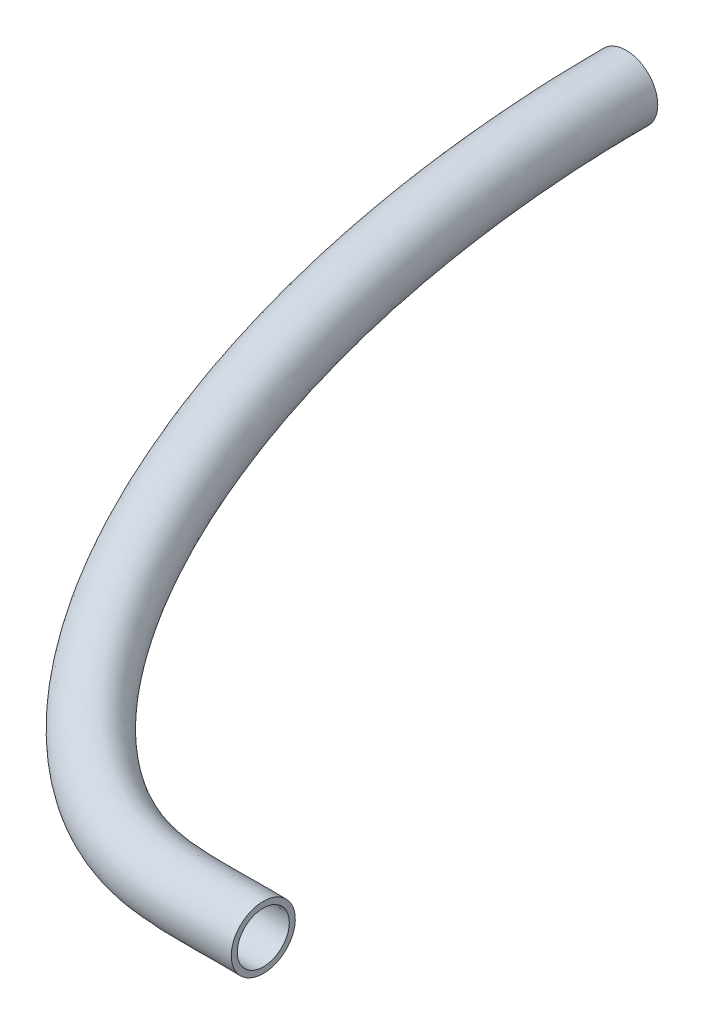
ISO-10303-21;
HEADER;
FILE_DESCRIPTION(('STEP AP214'),'2;1');
FILE_NAME('part.step','',(''),(''),'','','');
FILE_SCHEMA(('AUTOMOTIVE_DESIGN { 1 0 10303 214 1 1 1 1 }'));
ENDSEC;
DATA;
#1=APPLICATION_CONTEXT('core data for automotive mechanical design processes');
#2=APPLICATION_PROTOCOL_DEFINITION('international standard','automotive_design',2000,#1);
#3=PRODUCT_CONTEXT('',#1,'mechanical');
#4=PRODUCT('Part','Part','',(#3));
#5=PRODUCT_RELATED_PRODUCT_CATEGORY('part','',(#4));
#6=PRODUCT_DEFINITION_FORMATION('','',#4);
#7=PRODUCT_DEFINITION_CONTEXT('part definition',#1,'design');
#8=PRODUCT_DEFINITION('design','',#6,#7);
#9=PRODUCT_DEFINITION_SHAPE('','',#8);
#10=(LENGTH_UNIT() NAMED_UNIT(*) SI_UNIT(.MILLI.,.METRE.));
#11=(NAMED_UNIT(*) PLANE_ANGLE_UNIT() SI_UNIT($,.RADIAN.));
#12=(NAMED_UNIT(*) SI_UNIT($,.STERADIAN.) SOLID_ANGLE_UNIT());
#13=UNCERTAINTY_MEASURE_WITH_UNIT(LENGTH_MEASURE(1.E-05),#10,'distance_accuracy_value','');
#14=(GEOMETRIC_REPRESENTATION_CONTEXT(3) GLOBAL_UNCERTAINTY_ASSIGNED_CONTEXT((#13)) GLOBAL_UNIT_ASSIGNED_CONTEXT((#10,
#11,#12)) REPRESENTATION_CONTEXT('',''));
#15=CARTESIAN_POINT('',(0.,0.,0.));
#16=DIRECTION('',(0.,0.,1.));
#17=DIRECTION('',(1.,0.,0.));
#18=AXIS2_PLACEMENT_3D('',#15,#16,#17);
#19=CARTESIAN_POINT('',(12.1586843067844,-7.52751038817287,0.));
#20=CARTESIAN_POINT('',(12.1586843067127,-7.52751038847759,41.1975525196105));
#21=CARTESIAN_POINT('',(12.8432206544592,-12.1097544256163,77.7303698545293));
#22=CARTESIAN_POINT('',(16.0276178795649,-22.5063376339829,125.210805236656));
#23=CARTESIAN_POINT('',(17.4481988464369,-26.5583328215066,139.817209254101));
#24=CARTESIAN_POINT('',(20.2434339619281,-33.0865597147382,159.846127553321));
#25=CARTESIAN_POINT('',(21.2857398575284,-35.3375648297478,166.208889992822));
#26=CARTESIAN_POINT('',(22.7378735440379,-38.1993574676171,173.764468662107));
#27=CARTESIAN_POINT('',(23.0357552451373,-38.7741159067826,175.255688694486));
#28=CARTESIAN_POINT('',(23.4939424466096,-39.638990247409,177.462559069099));
#29=CARTESIAN_POINT('',(23.648384917167,-39.934936066806,178.190329675185));
#30=CARTESIAN_POINT('',(23.9625640615991,-40.4700906146351,179.658580538403));
#31=CARTESIAN_POINT('',(24.1222666785517,-40.7107506925654,180.398584429151));
#32=CARTESIAN_POINT('',(24.9290518773624,-41.8276463207582,184.11168857733));
#33=CARTESIAN_POINT('',(25.596518824201,-42.7299859497505,187.009199653802));
#34=CARTESIAN_POINT('',(29.0521015910951,-47.2758318351706,201.12468428905));
#35=CARTESIAN_POINT('',(32.1941545984994,-51.0331040791956,211.2248487293));
#36=CARTESIAN_POINT('',(39.5013817329044,-58.3768667479807,228.851562229635));
#37=CARTESIAN_POINT('',(43.6722722911921,-61.9532736439962,236.370319473424));
#38=CARTESIAN_POINT('',(50.8035433234006,-66.735201828949,245.695964691155));
#39=CARTESIAN_POINT('',(53.324445756884,-68.2319031978676,248.481403575702));
#40=CARTESIAN_POINT('',(58.6690648791445,-70.9714229653328,253.436402206764));
#41=CARTESIAN_POINT('',(61.4919404521863,-72.2144599448679,255.606558464509));
#42=CARTESIAN_POINT('',(67.4829695291432,-74.4031819844309,259.377311696391));
#43=CARTESIAN_POINT('',(70.6513201726939,-75.3496740177342,260.97897567528));
#44=CARTESIAN_POINT('',(77.4187286732156,-76.902164567047,263.648304616309));
#45=CARTESIAN_POINT('',(81.0192092392658,-77.5086250124912,264.716349032614));
#46=CARTESIAN_POINT('',(85.6126147160689,-77.9875654913768,265.667044997799));
#47=CARTESIAN_POINT('',(86.3574792173627,-78.0651986450064,265.776542196973));
#48=CARTESIAN_POINT('',(87.8769288259186,-78.2118929662791,265.960875363933));
#49=CARTESIAN_POINT('',(88.6508119807861,-78.2786912949391,266.044812815406));
#50=CARTESIAN_POINT('',(91.0150601751882,-78.4607083368753,266.27353181065));
#51=CARTESIAN_POINT('',(92.6480861684886,-78.5575019338745,266.395160719871));
#52=CARTESIAN_POINT('',(97.7154982968154,-78.7859451977329,266.682217982399));
#53=CARTESIAN_POINT('',(101.318234375749,-78.8550462168895,266.769048949081));
#54=CARTESIAN_POINT('',(112.761863849584,-78.9312717968913,266.864832496717));
#55=CARTESIAN_POINT('',(121.233814581769,-78.804170795922,266.705119908072));
#56=CARTESIAN_POINT('',(130.466353488673,-78.8940352313156,266.81804176915));
#57=CARTESIAN_POINT('',(12.1586843067844,16.7898582253958,0.));
#58=CARTESIAN_POINT('',(12.1586843066947,16.7898582254496,42.9990222116649));
#59=CARTESIAN_POINT('',(12.8723735872278,12.0005973383329,81.3051298975339));
#60=CARTESIAN_POINT('',(16.2195974159491,1.07266559470776,131.212202421823));
#61=CARTESIAN_POINT('',(17.7144560272099,-3.1920597757677,146.589147568087));
#62=CARTESIAN_POINT('',(20.6597925400027,-10.0707185281473,167.693209914881));
#63=CARTESIAN_POINT('',(21.7585484719433,-12.4436822008069,174.400891345326));
#64=CARTESIAN_POINT('',(23.2897679867195,-15.4613095135952,182.36789800938));
#65=CARTESIAN_POINT('',(23.6038924956125,-16.0674016470866,183.9404151843));
#66=CARTESIAN_POINT('',(24.0870849005691,-16.9794613805486,186.267686974441));
#67=CARTESIAN_POINT('',(24.2651439421214,-17.29034532218,187.032307992103));
#68=CARTESIAN_POINT('',(24.5055798404796,-17.8617671657379,188.597669246575));
#69=CARTESIAN_POINT('',(24.5709570531288,-18.1237132473793,189.397547567295));
#70=CARTESIAN_POINT('',(24.7200614404185,-19.367092543026,193.448408627697));
#71=CARTESIAN_POINT('',(24.8681227578949,-20.3958942823677,196.618968238852));
#72=CARTESIAN_POINT('',(25.7904591181671,-25.6968217714256,212.112385951867));
#73=CARTESIAN_POINT('',(27.1251775830531,-30.4598572078821,223.351533188934));
#74=CARTESIAN_POINT('',(31.8361476379713,-40.3052491722367,243.366048622979));
#75=CARTESIAN_POINT('',(35.2110825190456,-45.3701789931757,252.147495307245));
#76=CARTESIAN_POINT('',(42.1056176380643,-52.5054427149052,263.422734447782));
#77=CARTESIAN_POINT('',(44.7062576104599,-54.807268175301,266.864795876721));
#78=CARTESIAN_POINT('',(50.532428429765,-59.1509204078366,273.096360789708));
#79=CARTESIAN_POINT('',(53.7581319056505,-61.1926891733201,275.885627887412));
#80=CARTESIAN_POINT('',(60.8324271415119,-64.9128805473243,280.78376742386));
#81=CARTESIAN_POINT('',(64.6807895881424,-66.5909947570791,282.89212327362));
#82=CARTESIAN_POINT('',(72.9749066259975,-69.489392208673,286.404644108681));
#83=CARTESIAN_POINT('',(77.4198760623726,-70.709576045639,287.808668551372));
#84=CARTESIAN_POINT('',(83.0347985783379,-71.8412417337126,289.054026461098));
#85=CARTESIAN_POINT('',(83.9448359587043,-71.9548434542553,289.190273014995));
#86=CARTESIAN_POINT('',(85.7808936992905,-72.1321045115651,289.413015734589));
#87=CARTESIAN_POINT('',(86.7044278146761,-72.211708574661,289.513044617326));
#88=CARTESIAN_POINT('',(89.4916065774672,-72.4262858915024,289.78267820648));
#89=CARTESIAN_POINT('',(91.3717952874428,-72.5370487994941,289.921860674111));
#90=CARTESIAN_POINT('',(97.0807385270225,-72.7944128334708,290.245259201314));
#91=CARTESIAN_POINT('',(100.977861954208,-72.866407028523,290.335725675255));
#92=CARTESIAN_POINT('',(112.970454636422,-72.946289231635,290.436104062768));
#93=CARTESIAN_POINT('',(121.36941536279,-72.8197137472078,290.277051827634));
#94=CARTESIAN_POINT('',(130.236387281418,-72.9060199553362,290.38550249122));
#95=CARTESIAN_POINT('',(-12.1586843067844,16.7898582253958,0.));
#96=CARTESIAN_POINT('',(-12.1586843067306,16.789858225593,43.2667417442443));
#97=CARTESIAN_POINT('',(-11.44896610806,11.9793933573731,82.0468911595671));
#98=CARTESIAN_POINT('',(-8.01716826985207,0.775418528499522,133.215000833013));
#99=CARTESIAN_POINT('',(-6.47806276599943,-3.62349820437571,149.105172799613));
#100=CARTESIAN_POINT('',(-3.39889628243626,-10.81466029745,171.168188607289));
#101=CARTESIAN_POINT('',(-2.24395424747955,-13.3105468695261,178.227231473753));
#102=CARTESIAN_POINT('',(-0.619428500753249,-16.5120454965001,186.679721505122));
#103=CARTESIAN_POINT('',(-0.285473861222463,-17.1564265785618,188.351653397099));
#104=CARTESIAN_POINT('',(0.229428356981685,-18.1283341825885,190.831658211143));
#105=CARTESIAN_POINT('',(0.418746182289974,-18.4451733046582,191.653511207783));
#106=CARTESIAN_POINT('',(0.679438497043376,-19.1443449695036,193.289131258063));
#107=CARTESIAN_POINT('',(0.753881456149703,-19.5251829930562,194.10298912852));
#108=CARTESIAN_POINT('',(0.952828361048926,-21.5410847374464,198.150572915091));
#109=CARTESIAN_POINT('',(1.16407175976329,-23.1870684756282,201.314037164922));
#110=CARTESIAN_POINT('',(2.51810265148887,-31.5474232248089,216.761406484199));
#111=CARTESIAN_POINT('',(4.57029976329344,-38.6506101909509,227.933079690626));
#112=CARTESIAN_POINT('',(11.3175886952965,-52.7041593257679,248.062566711847));
#113=CARTESIAN_POINT('',(15.9999309438898,-59.6572618465298,257.042042647318));
#114=CARTESIAN_POINT('',(25.3861675437543,-69.3688834566938,268.795963071672));
#115=CARTESIAN_POINT('',(28.909827300712,-72.487166686324,272.42324665755));
#116=CARTESIAN_POINT('',(36.7856891105547,-78.362581349095,279.007506104911));
#117=CARTESIAN_POINT('',(41.1397460235438,-81.1192176143535,281.963052558088));
#118=CARTESIAN_POINT('',(50.6385985294994,-86.1197648894087,287.074967892651));
#119=CARTESIAN_POINT('',(55.7827705292926,-88.3617535544579,289.228686175097));
#120=CARTESIAN_POINT('',(66.714624829818,-92.1896401248808,292.633635004043));
#121=CARTESIAN_POINT('',(72.4986765570719,-93.774514766949,293.883966098529));
#122=CARTESIAN_POINT('',(79.6391036211194,-95.2197628278554,294.825627615149));
#123=CARTESIAN_POINT('',(80.7702305703068,-95.3612605153826,294.973037842113));
#124=CARTESIAN_POINT('',(83.0228877722456,-95.5787419096972,295.246320637387));
#125=CARTESIAN_POINT('',(84.1433356849533,-95.6751960203262,295.367522954723));
#126=CARTESIAN_POINT('',(87.4870151473063,-95.9326168133597,295.690992804207));
#127=CARTESIAN_POINT('',(89.69242561937,-96.0617608267505,295.853272603284));
#128=CARTESIAN_POINT('',(96.2455086282053,-96.3571794021045,296.224489710394));
#129=CARTESIAN_POINT('',(100.529992954463,-96.4329804972287,296.319739859285));
#130=CARTESIAN_POINT('',(113.244922663358,-96.517674159823,296.426164231111));
#131=CARTESIAN_POINT('',(121.547841647068,-96.3917901607381,296.267980902884));
#132=CARTESIAN_POINT('',(129.933793038329,-96.4734143807128,296.37054827308));
#133=CARTESIAN_POINT('',(-12.1586843067844,-7.52751038817287,0.));
#134=CARTESIAN_POINT('',(-12.1586843067127,-7.52751038833419,41.4652720521899));
#135=CARTESIAN_POINT('',(-11.4781190408572,-12.1309584065761,78.4721311164484));
#136=CARTESIAN_POINT('',(-8.20914780622197,-22.8035847001912,127.213603647902));
#137=CARTESIAN_POINT('',(-6.74431994676618,-26.9897712501146,142.333234485627));
#138=CARTESIAN_POINT('',(-3.81525486051396,-33.8305014840408,163.321106245728));
#139=CARTESIAN_POINT('',(-2.71676286189153,-36.2044294984729,170.035230121202));
#140=CARTESIAN_POINT('',(-1.17132294343553,-39.2500934505205,178.076292157861));
#141=CARTESIAN_POINT('',(-0.853611111696972,-39.8631408382564,179.666926907297));
#142=CARTESIAN_POINT('',(-0.36371409697813,-40.7878630494496,182.026530305796));
#143=CARTESIAN_POINT('',(-0.198012842664056,-41.0897640492857,182.811532890859));
#144=CARTESIAN_POINT('',(0.136422718162423,-41.7526684183993,184.350042549897));
#145=CARTESIAN_POINT('',(0.305191081572968,-42.112220438241,185.104025990376));
#146=CARTESIAN_POINT('',(1.16181879799139,-44.0016385151842,188.813852864723));
#147=CARTESIAN_POINT('',(1.89246782607208,-45.5211601430137,191.704268579873));
#148=CARTESIAN_POINT('',(5.77974512440591,-53.126433288543,205.773704821382));
#149=CARTESIAN_POINT('',(9.63927677873972,-59.2238570622267,215.806395230993));
#150=CARTESIAN_POINT('',(18.9828227902296,-70.7757769015496,233.548080318502));
#151=CARTESIAN_POINT('',(24.4611207160444,-76.2403564973177,241.264866813628));
#152=CARTESIAN_POINT('',(34.0840932290865,-83.5986425707538,251.069193314979));
#153=CARTESIAN_POINT('',(37.5280154471207,-85.9118017088752,254.0398543565));
#154=CARTESIAN_POINT('',(44.9223255599496,-90.1830839066067,259.347547521998));
#155=CARTESIAN_POINT('',(48.873554570072,-92.1409883859012,261.683983135244));
#156=CARTESIAN_POINT('',(57.2891409171383,-95.6100663265152,265.668512165122));
#157=CARTESIAN_POINT('',(61.7533011138442,-97.1204328151282,267.315538576847));
#158=CARTESIAN_POINT('',(71.1584468770361,-99.6024124832396,269.877295511581));
#159=CARTESIAN_POINT('',(76.0980097339492,-100.573563733817,270.79164657974));
#160=CARTESIAN_POINT('',(82.2169197588534,-101.366086585517,271.438646151856));
#161=CARTESIAN_POINT('',(83.1828738289622,-101.471615706131,271.559307024098));
#162=CARTESIAN_POINT('',(85.1189228988768,-101.658530364414,271.794180266724));
#163=CARTESIAN_POINT('',(86.0897198510603,-101.742178740598,271.899291152821));
#164=CARTESIAN_POINT('',(89.0104687450335,-101.967039258745,272.181846408341));
#165=CARTESIAN_POINT('',(90.9687165004158,-102.082213961125,272.326572649018));
#166=CARTESIAN_POINT('',(96.8802683979982,-102.348711766379,272.66144849153));
#167=CARTESIAN_POINT('',(100.870365376003,-102.421619685609,272.75306313311));
#168=CARTESIAN_POINT('',(113.036331876519,-102.502656725052,272.85489266506));
#169=CARTESIAN_POINT('',(121.412240866297,-102.376247209577,272.696048983197));
#170=CARTESIAN_POINT('',(130.163759245584,-102.461429656692,272.803087551009));
#171=CARTESIAN_POINT('',(-12.1586843067844,-31.8448790017416,0.));
#172=CARTESIAN_POINT('',(-12.1586843066947,-31.8448790022614,39.6638023601354));
#173=CARTESIAN_POINT('',(-11.5072719736543,-36.2413101705253,74.8973710733297));
#174=CARTESIAN_POINT('',(-8.40112734259187,-46.3825879288818,121.212206462791));
#175=CARTESIAN_POINT('',(-7.01057712753292,-50.3560442958536,135.561296171642));
#176=CARTESIAN_POINT('',(-4.23161343859166,-56.8463426706317,155.474023884168));
#177=CARTESIAN_POINT('',(-3.18957147630351,-59.0983121274197,161.843228768651));
#178=CARTESIAN_POINT('',(-1.72321738611782,-61.9881414045409,169.4728628106));
#179=CARTESIAN_POINT('',(-1.42174836217148,-62.5698550979509,170.982200417496));
#180=CARTESIAN_POINT('',(-0.956856550937946,-63.4473919163108,173.221402400449));
#181=CARTESIAN_POINT('',(-0.814771867618087,-63.7343547939131,173.969554573936));
#182=CARTESIAN_POINT('',(-0.40659306071853,-64.360991867295,175.410953841731));
#183=CARTESIAN_POINT('',(-0.143499293003768,-64.6992578834257,176.105062852232));
#184=CARTESIAN_POINT('',(1.37080923493386,-66.462192292922,179.477132814356));
#185=CARTESIAN_POINT('',(2.62086389238087,-67.8552518103992,182.094499994823));
#186=CARTESIAN_POINT('',(9.04138759732295,-74.705443352277,194.786003158565));
#187=CARTESIAN_POINT('',(14.708253794186,-79.7971039335026,203.67971077136));
#188=CARTESIAN_POINT('',(26.6480568851627,-88.8473944773313,219.033593925158));
#189=CARTESIAN_POINT('',(32.9223104881991,-92.8234511481055,225.487690979938));
#190=CARTESIAN_POINT('',(42.7820189144188,-97.8284016848139,233.342423558287));
#191=CARTESIAN_POINT('',(46.1462035935294,-99.3364367314264,235.656462055451));
#192=CARTESIAN_POINT('',(53.0589620093446,-102.003586464118,239.687588939085));
#193=CARTESIAN_POINT('',(56.6073631166003,-103.162759157449,241.404913712401));
#194=CARTESIAN_POINT('',(63.9396833047771,-105.100367763622,244.262056437592));
#195=CARTESIAN_POINT('',(67.7238316983958,-105.879112075799,245.402390978597));
#196=CARTESIAN_POINT('',(75.6022689242542,-107.015184841598,247.120956019119));
#197=CARTESIAN_POINT('',(79.6973429108265,-107.372612700685,247.699327060951));
#198=CARTESIAN_POINT('',(84.7947358965875,-107.512410343178,248.051664688563));
#199=CARTESIAN_POINT('',(85.5955170876176,-107.581970896879,248.145576206083));
#200=CARTESIAN_POINT('',(87.2149580255079,-107.738318819131,248.342039896062));
#201=CARTESIAN_POINT('',(88.0361040171672,-107.80916146087,248.431059350919));
#202=CARTESIAN_POINT('',(90.5339223427606,-108.00146170413,248.672700012475));
#203=CARTESIAN_POINT('',(92.2450073814615,-108.102667095499,248.799872694752));
#204=CARTESIAN_POINT('',(97.5150281677911,-108.340244130654,249.098407272666));
#205=CARTESIAN_POINT('',(101.210737797543,-108.410258873989,249.186386406935));
#206=CARTESIAN_POINT('',(112.827741089681,-108.487639290281,249.283621099009));
#207=CARTESIAN_POINT('',(121.276640085525,-108.360704258416,249.12411706351));
#208=CARTESIAN_POINT('',(130.393725452838,-108.449444932672,249.235626828939));
#209=CARTESIAN_POINT('',(12.1586843067844,-31.8448790017416,0.));
#210=CARTESIAN_POINT('',(12.1586843067306,-31.8448790024048,39.396082827556));
#211=CARTESIAN_POINT('',(12.8140677216906,-36.2201061895656,74.1556098115248));
#212=CARTESIAN_POINT('',(15.8356383431807,-46.0853408626736,119.209408051488));
#213=CARTESIAN_POINT('',(17.1819416656639,-49.9246058672456,133.045270940115));
#214=CARTESIAN_POINT('',(19.8270753838536,-56.102400901329,151.99904519176));
#215=CARTESIAN_POINT('',(20.8129312431135,-58.2314474586887,158.016888640318));
#216=CARTESIAN_POINT('',(22.1859791013564,-60.9374054216389,165.161039314834));
#217=CARTESIAN_POINT('',(22.4676179946621,-61.4808301664786,166.570962204673));
#218=CARTESIAN_POINT('',(22.9007999926502,-62.2985191142695,168.657431163758));
#219=CARTESIAN_POINT('',(23.0316258922126,-62.579526811432,169.348351358267));
#220=CARTESIAN_POINT('',(23.4195482827185,-63.0784140635322,170.719491830231));
#221=CARTESIAN_POINT('',(23.6735763039747,-63.2977881377516,171.399621291007));
#222=CARTESIAN_POINT('',(25.1380423143063,-64.2882000984903,174.774968526962));
#223=CARTESIAN_POINT('',(26.3249148905071,-65.0640776171333,177.399431068753));
#224=CARTESIAN_POINT('',(32.3137440640231,-68.8548418989156,190.136982626233));
#225=CARTESIAN_POINT('',(37.2631316139456,-71.6063509505091,199.098164269667));
#226=CARTESIAN_POINT('',(47.1666158278375,-76.4484843237247,214.33707583629));
#227=CARTESIAN_POINT('',(52.1334620633386,-78.5363682948166,220.593143639604));
#228=CARTESIAN_POINT('',(59.5014690087369,-80.9649609429927,227.969194934527));
#229=CARTESIAN_POINT('',(61.9426339033082,-81.6565382204343,230.098011274684));
#230=CARTESIAN_POINT('',(66.805701328524,-82.7919255228291,233.776443623821));
#231=CARTESIAN_POINT('',(69.2257489987221,-83.2362307164156,235.327489041605));
#232=CARTESIAN_POINT('',(74.1335119167745,-83.8934834215374,237.970855968921));
#233=CARTESIAN_POINT('',(76.6218507572455,-84.1083532783894,239.065828076939));
#234=CARTESIAN_POINT('',(81.8625507204337,-84.3149369254209,240.891965123938));
#235=CARTESIAN_POINT('',(84.6185424161591,-84.3076739793435,241.624029513857));
#236=CARTESIAN_POINT('',(88.1904308538,-84.133889249041,242.280063534499));
#237=CARTESIAN_POINT('',(88.7701224760212,-84.1755538357575,242.362811378952));
#238=CARTESIAN_POINT('',(89.9729639525467,-84.2916814209932,242.508734993277));
#239=CARTESIAN_POINT('',(90.5971961468962,-84.3456740152172,242.576581013485));
#240=CARTESIAN_POINT('',(92.5385137729092,-84.4951307822483,242.764385414821));
#241=CARTESIAN_POINT('',(93.9243770495344,-84.577955068255,242.86846076563));
#242=CARTESIAN_POINT('',(98.3502580666083,-84.777477561995,243.119176763484));
#243=CARTESIAN_POINT('',(101.658606797289,-84.8436854052561,243.202372222905));
#244=CARTESIAN_POINT('',(112.553273062745,-84.9162543621476,243.293560930666));
#245=CARTESIAN_POINT('',(121.098213800748,-84.7886278446361,243.133187988509));
#246=CARTESIAN_POINT('',(130.696319695927,-84.882050507295,243.250581047079));
#247=CARTESIAN_POINT('',(12.1586843067844,-7.52751038817287,0.));
#248=CARTESIAN_POINT('',(12.1586843067127,-7.52751038847759,41.1975525196105));
#249=CARTESIAN_POINT('',(12.8432206544592,-12.1097544256163,77.7303698545293));
#250=CARTESIAN_POINT('',(16.0276178795649,-22.5063376339829,125.210805236656));
#251=CARTESIAN_POINT('',(17.4481988464369,-26.5583328215066,139.817209254101));
#252=CARTESIAN_POINT('',(20.2434339619281,-33.0865597147382,159.846127553321));
#253=CARTESIAN_POINT('',(21.2857398575284,-35.3375648297478,166.208889992822));
#254=CARTESIAN_POINT('',(22.7378735440379,-38.1993574676171,173.764468662107));
#255=CARTESIAN_POINT('',(23.0357552451373,-38.7741159067826,175.255688694486));
#256=CARTESIAN_POINT('',(23.4939424466096,-39.638990247409,177.462559069099));
#257=CARTESIAN_POINT('',(23.648384917167,-39.934936066806,178.190329675185));
#258=CARTESIAN_POINT('',(23.9625640615991,-40.4700906146351,179.658580538403));
#259=CARTESIAN_POINT('',(24.1222666785517,-40.7107506925654,180.398584429151));
#260=CARTESIAN_POINT('',(24.9290518773624,-41.8276463207582,184.11168857733));
#261=CARTESIAN_POINT('',(25.596518824201,-42.7299859497505,187.009199653802));
#262=CARTESIAN_POINT('',(29.0521015910951,-47.2758318351706,201.12468428905));
#263=CARTESIAN_POINT('',(32.1941545984994,-51.0331040791956,211.2248487293));
#264=CARTESIAN_POINT('',(39.5013817329044,-58.3768667479807,228.851562229635));
#265=CARTESIAN_POINT('',(43.6722722911921,-61.9532736439962,236.370319473424));
#266=CARTESIAN_POINT('',(50.8035433234006,-66.735201828949,245.695964691155));
#267=CARTESIAN_POINT('',(53.324445756884,-68.2319031978676,248.481403575702));
#268=CARTESIAN_POINT('',(58.6690648791445,-70.9714229653328,253.436402206764));
#269=CARTESIAN_POINT('',(61.4919404521863,-72.2144599448679,255.606558464509));
#270=CARTESIAN_POINT('',(67.4829695291432,-74.4031819844309,259.377311696391));
#271=CARTESIAN_POINT('',(70.6513201726939,-75.3496740177342,260.97897567528));
#272=CARTESIAN_POINT('',(77.4187286732156,-76.902164567047,263.648304616309));
#273=CARTESIAN_POINT('',(81.0192092392658,-77.5086250124912,264.716349032614));
#274=CARTESIAN_POINT('',(85.6126147160689,-77.9875654913768,265.667044997799));
#275=CARTESIAN_POINT('',(86.3574792173627,-78.0651986450064,265.776542196973));
#276=CARTESIAN_POINT('',(87.8769288259186,-78.2118929662791,265.960875363933));
#277=CARTESIAN_POINT('',(88.6508119807861,-78.2786912949391,266.044812815406));
#278=CARTESIAN_POINT('',(91.0150601751882,-78.4607083368753,266.27353181065));
#279=CARTESIAN_POINT('',(92.6480861684886,-78.5575019338745,266.395160719871));
#280=CARTESIAN_POINT('',(97.7154982968154,-78.7859451977329,266.682217982399));
#281=CARTESIAN_POINT('',(101.318234375749,-78.8550462168895,266.769048949081));
#282=CARTESIAN_POINT('',(112.761863849584,-78.9312717968913,266.864832496717));
#283=CARTESIAN_POINT('',(121.233814581769,-78.804170795922,266.705119908072));
#284=CARTESIAN_POINT('',(130.466353488673,-78.8940352313156,266.81804176915));
#285=(BOUNDED_SURFACE() B_SPLINE_SURFACE(3,3,((#19,#20,#21,#22,#23,#24,#25,#26,#27,#28,#29,#30,
#31,#32,#33,#34,#35,#36,#37,#38,#39,#40,#41,#42,#43,#44,#45,#46,#47,#48,#49,#50,#51,#52,#53,#54,
#55,#56),(#57,#58,#59,#60,#61,#62,#63,#64,#65,#66,#67,#68,#69,#70,#71,#72,#73,#74,#75,#76,#77,
#78,#79,#80,#81,#82,#83,#84,#85,#86,#87,#88,#89,#90,#91,#92,#93,#94),(#95,#96,#97,#98,#99,#100,
#101,#102,#103,#104,#105,#106,#107,#108,#109,#110,#111,#112,#113,#114,#115,#116,#117,#118,#119,
#120,#121,#122,#123,#124,#125,#126,#127,#128,#129,#130,#131,#132),(#133,#134,#135,#136,#137,
#138,#139,#140,#141,#142,#143,#144,#145,#146,#147,#148,#149,#150,#151,#152,#153,#154,#155,#156,
#157,#158,#159,#160,#161,#162,#163,#164,#165,#166,#167,#168,#169,#170),(#171,#172,#173,#174,
#175,#176,#177,#178,#179,#180,#181,#182,#183,#184,#185,#186,#187,#188,#189,#190,#191,#192,#193,
#194,#195,#196,#197,#198,#199,#200,#201,#202,#203,#204,#205,#206,#207,#208),(#209,#210,#211,
#212,#213,#214,#215,#216,#217,#218,#219,#220,#221,#222,#223,#224,#225,#226,#227,#228,#229,#230,
#231,#232,#233,#234,#235,#236,#237,#238,#239,#240,#241,#242,#243,#244,#245,#246),(#247,#248,
#249,#250,#251,#252,#253,#254,#255,#256,#257,#258,#259,#260,#261,#262,#263,#264,#265,#266,#267,
#268,#269,#270,#271,#272,#273,#274,#275,#276,#277,#278,#279,#280,#281,#282,#283,#284)),
.UNSPECIFIED.,.T.,.F.,.F.) B_SPLINE_SURFACE_WITH_KNOTS((4,3,4),(4,2,2,2,2,2,2,2,2,2,2,2,2,2,2,2,
2,2,4),(0.,0.5,1.),(0.,0.210467402575889,0.315701103863834,0.368317954507806,0.381472167168799,
0.388049273499296,0.394626379829793,0.420934805151779,0.526168506439723,0.631402207727668,
0.68401905837164,0.736635909015613,0.789252759659585,0.841869610303557,0.851752759659585,
0.861635909015613,0.881402207727668,0.920934805151779,1.),
.UNSPECIFIED.) GEOMETRIC_REPRESENTATION_ITEM() RATIONAL_B_SPLINE_SURFACE(((1.,1.,1.,1.,1.,1.,1.,
1.,1.,1.,1.,1.,1.,1.,1.,1.,1.,1.,1.,1.,1.,1.,1.,1.,1.,1.,1.,1.,1.,1.,1.,1.,1.,1.,1.,1.,1.,1.),
(0.333333333333333,0.333333333333333,0.333333333333333,0.333333333333333,0.333333333333333,
0.333333333333333,0.333333333333333,0.333333333333333,0.333333333333333,0.333333333333333,
0.333333333333333,0.333333333333333,0.333333333333333,0.333333333333333,0.333333333333333,
0.333333333333333,0.333333333333333,0.333333333333333,0.333333333333333,0.333333333333333,
0.333333333333333,0.333333333333333,0.333333333333333,0.333333333333333,0.333333333333333,
0.333333333333333,0.333333333333333,0.333333333333333,0.333333333333333,0.333333333333333,
0.333333333333333,0.333333333333333,0.333333333333333,0.333333333333333,0.333333333333333,
0.333333333333333,0.333333333333333,0.333333333333333),(0.333333333333333,0.333333333333333,
0.333333333333333,0.333333333333333,0.333333333333333,0.333333333333333,0.333333333333333,
0.333333333333333,0.333333333333333,0.333333333333333,0.333333333333333,0.333333333333333,
0.333333333333333,0.333333333333333,0.333333333333333,0.333333333333333,0.333333333333333,
0.333333333333333,0.333333333333333,0.333333333333333,0.333333333333333,0.333333333333333,
0.333333333333333,0.333333333333333,0.333333333333333,0.333333333333333,0.333333333333333,
0.333333333333333,0.333333333333333,0.333333333333333,0.333333333333333,0.333333333333333,
0.333333333333333,0.333333333333333,0.333333333333333,0.333333333333333,0.333333333333333,
0.333333333333333),(1.,1.,1.,1.,1.,1.,1.,1.,1.,1.,1.,1.,1.,1.,1.,1.,1.,1.,1.,1.,1.,1.,1.,1.,1.,
1.,1.,1.,1.,1.,1.,1.,1.,1.,1.,1.,1.,1.),(0.333333333333333,0.333333333333333,0.333333333333333,
0.333333333333333,0.333333333333333,0.333333333333333,0.333333333333333,0.333333333333333,
0.333333333333333,0.333333333333333,0.333333333333333,0.333333333333333,0.333333333333333,
0.333333333333333,0.333333333333333,0.333333333333333,0.333333333333333,0.333333333333333,
0.333333333333333,0.333333333333333,0.333333333333333,0.333333333333333,0.333333333333333,
0.333333333333333,0.333333333333333,0.333333333333333,0.333333333333333,0.333333333333333,
0.333333333333333,0.333333333333333,0.333333333333333,0.333333333333333,0.333333333333333,
0.333333333333333,0.333333333333333,0.333333333333333,0.333333333333333,0.333333333333333),
(0.333333333333333,0.333333333333333,0.333333333333333,0.333333333333333,0.333333333333333,
0.333333333333333,0.333333333333333,0.333333333333333,0.333333333333333,0.333333333333333,
0.333333333333333,0.333333333333333,0.333333333333333,0.333333333333333,0.333333333333333,
0.333333333333333,0.333333333333333,0.333333333333333,0.333333333333333,0.333333333333333,
0.333333333333333,0.333333333333333,0.333333333333333,0.333333333333333,0.333333333333333,
0.333333333333333,0.333333333333333,0.333333333333333,0.333333333333333,0.333333333333333,
0.333333333333333,0.333333333333333,0.333333333333333,0.333333333333333,0.333333333333333,
0.333333333333333,0.333333333333333,0.333333333333333),(1.,1.,1.,1.,1.,1.,1.,1.,1.,1.,1.,1.,1.,
1.,1.,1.,1.,1.,1.,1.,1.,1.,1.,1.,1.,1.,1.,1.,1.,1.,1.,1.,1.,1.,1.,1.,1.,1.))) REPRESENTATION_ITEM('') SURFACE());
#286=CARTESIAN_POINT('',(130.315056367128,-90.6777324440039,269.81056466008));
#287=DIRECTION('',(0.999877855447999,-0.00973225894098325,0.0122293630502831));
#288=DIRECTION('',(0.0124435438676696,0.969158908592863,-0.246122262526378));
#289=AXIS2_PLACEMENT_3D('',#286,#287,#288);
#290=CIRCLE('',#289,12.1586843067844);
#291=CARTESIAN_POINT('',(130.466353488673,-78.8940352313156,266.81804176915));
#292=VERTEX_POINT('',#291);
#293=EDGE_CURVE('E53',#292,#292,#290,.T.);
#294=CARTESIAN_POINT('',(0.,-7.52751038817287,0.));
#295=DIRECTION('',(0.,0.,1.));
#296=DIRECTION('',(1.,0.,0.));
#297=AXIS2_PLACEMENT_3D('',#294,#295,#296);
#298=CIRCLE('',#297,12.1586843067844);
#299=CARTESIAN_POINT('',(12.1586843067844,-7.52751038817287,0.));
#300=VERTEX_POINT('',#299);
#301=EDGE_CURVE('E38',#300,#300,#298,.T.);
#302=ORIENTED_EDGE('',*,*,#293,.F.);
#303=EDGE_LOOP('',(#302));
#304=FACE_BOUND('',#303,.T.);
#305=ORIENTED_EDGE('',*,*,#301,.T.);
#306=EDGE_LOOP('',(#305));
#307=FACE_BOUND('',#306,.T.);
#308=ADVANCED_FACE('F33',(#304,#307),#285,.T.);
#309=CARTESIAN_POINT('',(0.,-7.52751038817287,0.));
#310=DIRECTION('',(0.,0.,1.));
#311=DIRECTION('',(1.,0.,0.));
#312=AXIS2_PLACEMENT_3D('',#309,#310,#311);
#313=PLANE('',#312);
#314=CARTESIAN_POINT('',(0.,-7.52751038817287,0.));
#315=DIRECTION('',(0.,0.,1.));
#316=DIRECTION('',(1.,0.,0.));
#317=AXIS2_PLACEMENT_3D('',#314,#315,#316);
#318=CIRCLE('',#317,9.88329352102297);
#319=CARTESIAN_POINT('',(9.88329352102297,-7.52751038817287,0.));
#320=VERTEX_POINT('',#319);
#321=EDGE_CURVE('E43',#320,#320,#318,.F.);
#322=ORIENTED_EDGE('',*,*,#321,.F.);
#323=EDGE_LOOP('',(#322));
#324=FACE_BOUND('',#323,.T.);
#325=ORIENTED_EDGE('',*,*,#301,.F.);
#326=EDGE_LOOP('',(#325));
#327=FACE_BOUND('',#326,.T.);
#328=ADVANCED_FACE('F71',(#324,#327),#313,.F.);
#329=CARTESIAN_POINT('',(130.315056367128,-90.6777324440039,269.81056466008));
#330=DIRECTION('',(0.999877855447999,-0.00973225894098325,0.0122293630502831));
#331=DIRECTION('',(0.0124435438676696,0.969158908592863,-0.246122262526378));
#332=AXIS2_PLACEMENT_3D('',#329,#330,#331);
#333=PLANE('',#332);
#334=CARTESIAN_POINT('',(130.315056367128,-90.6777324440039,269.81056466008));
#335=DIRECTION('',(0.999877855447999,-0.00973225894098325,0.0122293630502831));
#336=DIRECTION('',(0.0124435438676696,0.969158908592863,-0.246122262526378));
#337=AXIS2_PLACEMENT_3D('',#334,#335,#336);
#338=CIRCLE('',#337,9.88329352102297);
#339=CARTESIAN_POINT('',(130.438039563614,-81.0992504818663,267.378066097473));
#340=VERTEX_POINT('',#339);
#341=EDGE_CURVE('E11',#340,#340,#338,.F.);
#342=ORIENTED_EDGE('',*,*,#341,.T.);
#343=EDGE_LOOP('',(#342));
#344=FACE_BOUND('',#343,.T.);
#345=ORIENTED_EDGE('',*,*,#293,.T.);
#346=EDGE_LOOP('',(#345));
#347=FACE_BOUND('',#346,.T.);
#348=ADVANCED_FACE('F60',(#344,#347),#333,.T.);
#349=CARTESIAN_POINT('',(9.88329352102297,-7.52751038817287,0.));
#350=CARTESIAN_POINT('',(9.88329352102297,-7.52751038844174,41.2226031970617));
#351=CARTESIAN_POINT('',(10.5674582921834,-12.1117384948526,77.7997769015175));
#352=CARTESIAN_POINT('',(13.7597691581699,-22.5341512204879,125.398208286731));
#353=CARTESIAN_POINT('',(15.1844903333405,-26.5987027743867,140.052635246269));
#354=CARTESIAN_POINT('',(17.9922479995857,-33.1561707928899,160.171283396495));
#355=CARTESIAN_POINT('',(19.039811262581,-35.4186778774098,166.566922936732));
#356=CARTESIAN_POINT('',(20.5006756692575,-38.2976754645948,174.167928576195));
#357=CARTESIAN_POINT('',(20.8004128875891,-38.8760166236752,175.668450903376));
#358=CARTESIAN_POINT('',(21.2615671953316,-39.7464909654865,177.889612598757));
#359=CARTESIAN_POINT('',(21.4170631570489,-40.0429940147006,178.622738435491));
#360=CARTESIAN_POINT('',(21.7331377065244,-40.590102190023,180.097563456428));
#361=CARTESIAN_POINT('',(21.89368861082,-40.8418870583712,180.838875422041));
#362=CARTESIAN_POINT('',(22.7051376039377,-42.0310680760347,184.55167291374));
#363=CARTESIAN_POINT('',(23.3785165360665,-42.9911577953382,187.448520072986));
#364=CARTESIAN_POINT('',(26.8744932195242,-47.8232761269593,201.559695932403));
#365=CARTESIAN_POINT('',(30.0836811348066,-51.7995177550591,211.653546787118));
#366=CARTESIAN_POINT('',(37.5814478495772,-59.5370402176034,229.2910182478));
#367=CARTESIAN_POINT('',(41.8746733004312,-63.2901245671291,236.828305207728));
#368=CARTESIAN_POINT('',(51.6939013487348,-69.9874572870408,249.322219491429));
#369=CARTESIAN_POINT('',(57.2022823284,-72.9247343235292,254.279848560058));
#370=CARTESIAN_POINT('',(66.5291268636708,-76.3875228888073,259.965983102656));
#371=CARTESIAN_POINT('',(69.8187271853595,-77.3867769935537,261.571891671539));
#372=CARTESIAN_POINT('',(76.8329503457324,-79.026240397933,264.231155035474));
#373=CARTESIAN_POINT('',(80.5587296459515,-79.6668251810373,265.28481827286));
#374=CARTESIAN_POINT('',(85.2948774995296,-80.1751077508916,266.207097184099));
#375=CARTESIAN_POINT('',(86.0604294845559,-80.2553511468999,266.317638974854));
#376=CARTESIAN_POINT('',(87.6188605549161,-80.4058089092703,266.50670120709));
#377=CARTESIAN_POINT('',(88.411169052056,-80.4741839069957,266.592619869531));
#378=CARTESIAN_POINT('',(90.8274893511541,-80.6602098387238,266.826376355997));
#379=CARTESIAN_POINT('',(92.4909465400365,-80.7587233668053,266.950166496369));
#380=CARTESIAN_POINT('',(97.6373453335789,-80.990727416936,267.241698172192));
#381=CARTESIAN_POINT('',(101.276327004482,-81.0601846500255,267.32897675014));
#382=CARTESIAN_POINT('',(112.78754598766,-81.1368604411989,267.425326024266));
#383=CARTESIAN_POINT('',(121.25051003676,-81.0098241430162,267.265694739236));
#384=CARTESIAN_POINT('',(130.438039563614,-81.0992504818663,267.378066097473));
#385=CARTESIAN_POINT('',(9.88329352102297,-27.2940974302188,0.));
#386=CARTESIAN_POINT('',(9.88329352100505,-27.2940974307565,39.7582627070412));
#387=CARTESIAN_POINT('',(10.5437610742528,-31.7100500691513,74.894001746641));
#388=CARTESIAN_POINT('',(13.6037169028328,-41.7005514626942,120.519919779564));
#389=CARTESIAN_POINT('',(14.9680608412039,-45.5921834155936,134.548005602571));
#390=CARTESIAN_POINT('',(17.6538072659236,-51.8647998139902,153.792713453724));
#391=CARTESIAN_POINT('',(18.6554846201937,-54.0281718118279,159.907982557252));
#392=CARTESIAN_POINT('',(20.0520634154947,-56.7804978123479,167.17455533112));
#393=CARTESIAN_POINT('',(20.3385975245958,-57.3333691022919,168.608994560653));
#394=CARTESIAN_POINT('',(20.7794261326676,-58.1654883823639,170.732286906038));
#395=CARTESIAN_POINT('',(20.9157251568533,-58.4498488474815,171.435458561476));
#396=CARTESIAN_POINT('',(21.291742552756,-58.9674768323587,172.831346546429));
#397=CARTESIAN_POINT('',(21.5289666918924,-59.2019591852985,173.523989054813));
#398=CARTESIAN_POINT('',(22.8750173194806,-60.2883268409681,176.962237868537));
#399=CARTESIAN_POINT('',(23.9705996875979,-61.1456207211514,179.637135123856));
#400=CARTESIAN_POINT('',(29.5257480023051,-65.3639643274147,192.62824595684));
#401=CARTESIAN_POINT('',(34.2040437028774,-68.5226624949841,201.79626462347));
#402=CARTESIAN_POINT('',(43.8122008287969,-74.2267135732431,217.492790272348));
#403=CARTESIAN_POINT('',(48.752425855342,-76.769838965926,224.003689010479));
#404=CARTESIAN_POINT('',(58.8282310636715,-80.9165990223273,234.384610528368));
#405=CARTESIAN_POINT('',(63.929047868332,-82.5063118357272,238.254031486204));
#406=CARTESIAN_POINT('',(71.9350787604777,-84.1017979155612,242.56555721269));
#407=CARTESIAN_POINT('',(74.6719255047247,-84.5063464967599,243.759596836158));
#408=CARTESIAN_POINT('',(80.4451501972685,-85.0517776331841,245.733464249737));
#409=CARTESIAN_POINT('',(83.4844792887183,-85.1934919574585,246.514023166475));
#410=CARTESIAN_POINT('',(87.3902780288639,-85.1712010977943,247.196783523484));
#411=CARTESIAN_POINT('',(88.0215677858027,-85.222207127708,247.285581865892));
#412=CARTESIAN_POINT('',(89.3226411502651,-85.3478184497373,247.443422555282));
#413=CARTESIAN_POINT('',(89.993304547389,-85.4057841935487,247.516261156257));
#414=CARTESIAN_POINT('',(92.0658420126822,-85.565343219337,247.716759855036));
#415=CARTESIAN_POINT('',(93.5283908125633,-85.6525016700556,247.826281431006));
#416=CARTESIAN_POINT('',(98.1533153976088,-85.8609972177347,248.088272790121));
#417=CARTESIAN_POINT('',(101.553001722214,-85.9281027073336,248.172596213943));
#418=CARTESIAN_POINT('',(112.61799113122,-86.0018061802434,248.265210532144));
#419=CARTESIAN_POINT('',(121.140285748874,-85.8743427113293,248.105042472869));
#420=CARTESIAN_POINT('',(130.624969618616,-85.9666613865027,248.221048283347));
#421=CARTESIAN_POINT('',(-9.88329352102297,-27.2940974302188,0.));
#422=CARTESIAN_POINT('',(-9.8832935210409,-27.294097430649,39.9758808847182));
#423=CARTESIAN_POINT('',(-9.22605389649776,-31.7272859116955,75.4969489151546));
#424=CARTESIAN_POINT('',(-6.09735134017127,-41.942171355864,122.147912090374));
#425=CARTESIAN_POINT('',(-4.69704092582531,-45.9428819384667,136.593178850063));
#426=CARTESIAN_POINT('',(-1.9025096318241,-52.4695194269767,156.617380459633));
#427=CARTESIAN_POINT('',(-0.855160909340266,-54.7328103852173,163.018256797812));
#428=CARTESIAN_POINT('',(0.617262677584259,-57.6345978012989,170.679458998698));
#429=CARTESIAN_POINT('',(0.919915882855796,-58.2185925999876,172.194708355696));
#430=CARTESIAN_POINT('',(1.38652009163705,-59.099359748246,174.442151083414));
#431=CARTESIAN_POINT('',(1.53197091726171,-59.3885609341771,175.191844256538));
#432=CARTESIAN_POINT('',(1.92445391946539,-60.0100314853421,176.644842721873));
#433=CARTESIAN_POINT('',(2.16904723037855,-60.3411561993681,177.348848630258));
#434=CARTESIAN_POINT('',(3.5556127869532,-62.0554755248183,180.78443348311));
#435=CARTESIAN_POINT('',(4.70255326574476,-63.4144512232419,183.453563211581));
#436=CARTESIAN_POINT('',(10.6086082787302,-70.1196771971988,196.407243202379));
#437=CARTESIAN_POINT('',(15.8701128104938,-75.1805881262884,205.520415009451));
#438=CARTESIAN_POINT('',(27.1335096527858,-84.3052767875665,221.310396324959));
#439=CARTESIAN_POINT('',(33.1364722616917,-88.3832199729328,227.982264882011));
#440=CARTESIAN_POINT('',(45.9128127671303,-95.3222669341271,238.881986791402));
#441=CARTESIAN_POINT('',(52.6866705217787,-98.1833915293494,243.10723483502));
#442=CARTESIAN_POINT('',(63.6489354794175,-101.340000448893,247.679414868859));
#443=CARTESIAN_POINT('',(67.4390924205286,-102.20289934256,248.910327745026));
#444=CARTESIAN_POINT('',(75.3564250560705,-103.503873887559,250.796754306861));
#445=CARTESIAN_POINT('',(79.4842389700304,-103.942030341676,251.452382233143));
#446=CARTESIAN_POINT('',(84.6300575047271,-104.174637672907,251.888280304934));
#447=CARTESIAN_POINT('',(85.441061863016,-104.248319185036,251.986153137224));
#448=CARTESIAN_POINT('',(87.0807717652283,-104.406623961899,252.18507577179));
#449=CARTESIAN_POINT('',(87.9114982751234,-104.478286415088,252.275125385422));
#450=CARTESIAN_POINT('',(90.4363922305956,-104.672671137522,252.519385362034));
#451=CARTESIAN_POINT('',(92.1633004013947,-104.774770831476,252.647681807145));
#452=CARTESIAN_POINT('',(97.4743914252646,-105.014199347911,252.948542919692));
#453=CARTESIAN_POINT('',(101.188947465028,-105.08439930974,253.036754795909));
#454=CARTESIAN_POINT('',(112.841094881947,-105.162013819871,253.134283645279));
#455=CARTESIAN_POINT('',(121.285321124356,-105.035112430921,252.974821884979));
#456=CARTESIAN_POINT('',(130.379003225644,-105.123625310778,253.08604540856));
#457=CARTESIAN_POINT('',(-9.88329352102297,-7.52751038817287,0.));
#458=CARTESIAN_POINT('',(-9.88329352102297,-7.52751038837004,41.4402213747387));
#459=CARTESIAN_POINT('',(-9.20235667856713,-12.1289743373398,78.4027240699169));
#460=CARTESIAN_POINT('',(-5.94129908483413,-22.7757711136862,127.026200597598));
#461=CARTESIAN_POINT('',(-4.48061143368237,-26.9494012972346,142.097808493661));
#462=CARTESIAN_POINT('',(-1.56406889816523,-33.760890405889,162.995950402454));
#463=CARTESIAN_POINT('',(-0.47083426695001,-36.1233164507874,169.677197177292));
#464=CARTESIAN_POINT('',(1.06587493134636,-39.1517754535487,177.672832243773));
#465=CARTESIAN_POINT('',(1.38173124584979,-39.7612401213695,179.254164698407));
#466=CARTESIAN_POINT('',(1.86866115430067,-40.6803623313693,181.599476776138));
#467=CARTESIAN_POINT('',(2.03330891745623,-40.9817061013968,182.379124130553));
#468=CARTESIAN_POINT('',(2.36584907323491,-41.6326568430056,183.911059631872));
#469=CARTESIAN_POINT('',(2.53376914930544,-41.9810840724409,184.663734997486));
#470=CARTESIAN_POINT('',(3.3857330714132,-43.798216759885,188.373868528313));
#471=CARTESIAN_POINT('',(4.1104701142093,-45.259988297426,191.264948160689));
#472=CARTESIAN_POINT('',(7.95735349596579,-52.5789889967543,205.338693178029));
#473=CARTESIAN_POINT('',(11.7497502423948,-58.457443386288,215.377697173175));
#474=CARTESIAN_POINT('',(20.9027566735944,-69.6156034320022,233.108624300337));
#475=CARTESIAN_POINT('',(26.2587197068053,-74.9035055741196,240.806881079325));
#476=CARTESIAN_POINT('',(38.7784830521692,-84.3931251988568,253.819595754398));
#477=CARTESIAN_POINT('',(45.9599049818467,-88.6018140171514,259.133051908815));
#478=CARTESIAN_POINT('',(58.2429835826106,-93.6257254221388,265.079840758856));
#479=CARTESIAN_POINT('',(62.5858941011483,-95.0833298393391,266.722622580467));
#480=CARTESIAN_POINT('',(71.7442252045496,-97.4783366523233,269.294445092538));
#481=CARTESIAN_POINT('',(76.5584893272636,-98.4153635652711,270.223177339495));
#482=CARTESIAN_POINT('',(82.5346569753928,-99.1785443260017,270.898593965555));
#483=CARTESIAN_POINT('',(83.4799235617691,-99.2814632042311,271.018210246192));
#484=CARTESIAN_POINT('',(85.3769911698793,-99.4646144214292,271.248354423591));
#485=CARTESIAN_POINT('',(86.3293627797904,-99.5466861285354,271.351484098696));
#486=CARTESIAN_POINT('',(89.1980395690676,-99.7675377569088,271.629001862995));
#487=CARTESIAN_POINT('',(91.1258561288678,-99.8809925282193,271.77156687252));
#488=CARTESIAN_POINT('',(96.9584213612347,-100.143929547125,272.101968301737));
#489=CARTESIAN_POINT('',(100.912272747296,-100.216481252446,272.193135332051));
#490=CARTESIAN_POINT('',(113.010649738388,-100.297068080799,272.294399137511));
#491=CARTESIAN_POINT('',(121.395545412179,-100.170593862483,272.135474151284));
#492=CARTESIAN_POINT('',(130.192073170642,-100.256214406141,272.243063222686));
#493=CARTESIAN_POINT('',(-9.88329352102297,12.2390766538731,0.));
#494=CARTESIAN_POINT('',(-9.88329352100504,12.2390766539089,42.9045618647592));
#495=CARTESIAN_POINT('',(-9.1786594606365,7.46933723701598,81.3084992246792));
#496=CARTESIAN_POINT('',(-5.78524682949698,-3.60937087150835,131.904489104822));
#497=CARTESIAN_POINT('',(-4.26418194153944,-7.95592065600246,147.602438137258));
#498=CARTESIAN_POINT('',(-1.22562816450635,-15.0522613848014,169.374520345274));
#499=CARTESIAN_POINT('',(-0.0865076245597561,-17.5138225163576,176.336137556772));
#500=CARTESIAN_POINT('',(1.51448718510847,-20.6689531057984,184.666205488848));
#501=CARTESIAN_POINT('',(1.84354660884379,-21.3038876427514,186.313621041119));
#502=CARTESIAN_POINT('',(2.35080221696428,-22.2613649144926,188.756802468863));
#503=CARTESIAN_POINT('',(2.53464691765076,-22.5748512686166,189.566404004568));
#504=CARTESIAN_POINT('',(2.80724422700443,-23.2552822006692,191.177276541871));
#505=CARTESIAN_POINT('',(2.89849106823232,-23.6210119455136,191.978621364714));
#506=CARTESIAN_POINT('',(3.2158533558732,-25.5409579949516,195.963303573516));
#507=CARTESIAN_POINT('',(3.51838696267383,-27.10552537161,199.076333109797));
#508=CARTESIAN_POINT('',(5.30609871320137,-35.0383007963098,214.27014315368));
#509=CARTESIAN_POINT('',(7.62938767429579,-41.7342986462876,225.234979336899));
#510=CARTESIAN_POINT('',(14.672003694403,-54.9259300764379,244.906852275714));
#511=CARTESIAN_POINT('',(19.380967151919,-61.4237911753064,253.631497276639));
#512=CARTESIAN_POINT('',(31.6441533372081,-73.4639834635866,268.757204717395));
#513=CARTESIAN_POINT('',(39.2331394419148,-79.0202365049534,275.15886898261));
#514=CARTESIAN_POINT('',(52.8370316858038,-85.9114503953849,282.480266648853));
#515=CARTESIAN_POINT('',(57.732695781768,-87.9637603361177,284.534917415908));
#516=CARTESIAN_POINT('',(68.1320253530287,-91.4527994170873,287.792135878214));
#517=CARTESIAN_POINT('',(73.6327396844968,-92.8886967888659,288.993972445847));
#518=CARTESIAN_POINT('',(80.4392564460584,-94.1824509790961,289.908907626177));
#519=CARTESIAN_POINT('',(81.5187852605222,-94.314607223426,290.050267355161));
#520=CARTESIAN_POINT('',(83.6732105745302,-94.5226048809591,290.311633075393));
#521=CARTESIAN_POINT('',(84.7472272844574,-94.6150858419824,290.42784281197));
#522=CARTESIAN_POINT('',(87.9596869075395,-94.8624043762956,290.738618363955));
#523=CARTESIAN_POINT('',(90.088411856341,-94.9872142249626,290.895451937896));
#524=CARTESIAN_POINT('',(96.4424512972048,-95.2736597463394,291.255393683782));
#525=CARTESIAN_POINT('',(100.635598029565,-95.3485631951511,291.349515868192));
#526=CARTESIAN_POINT('',(113.180204594829,-95.4321223417272,291.454514629742));
#527=CARTESIAN_POINT('',(121.505769700003,-95.3060752940449,291.296126417588));
#528=CARTESIAN_POINT('',(130.005143115641,-95.388803501505,291.400081036812));
#529=CARTESIAN_POINT('',(9.88329352102297,12.2390766538731,0.));
#530=CARTESIAN_POINT('',(9.8832935210409,12.2390766538731,42.6869436870821));
#531=CARTESIAN_POINT('',(10.5911555101141,7.48657307944605,80.7055520563939));
#532=CARTESIAN_POINT('',(13.9158214135071,-3.36775097828149,130.276496793898));
#533=CARTESIAN_POINT('',(15.4009198254771,-7.60522213317977,145.557264889967));
#534=CARTESIAN_POINT('',(18.3306887332477,-14.4475417717897,166.549853339265));
#535=CARTESIAN_POINT('',(19.4241379049683,-16.8091839429917,173.225863316212));
#536=CARTESIAN_POINT('',(20.9492879230203,-19.8148531168416,181.161301821271));
#537=CARTESIAN_POINT('',(21.2622282505824,-20.4186641450586,182.7279072461));
#538=CARTESIAN_POINT('',(21.7437082579955,-21.327493548609,185.046938291475));
#539=CARTESIAN_POINT('',(21.9184011572445,-21.6361391819196,185.810018309506));
#540=CARTESIAN_POINT('',(22.1745328602929,-22.2127275476873,187.363780366427));
#541=CARTESIAN_POINT('',(22.2584105297476,-22.4818149314439,188.153761789269));
#542=CARTESIAN_POINT('',(22.5352578883949,-23.7738093111013,192.141107958942));
#543=CARTESIAN_POINT('',(22.7864333845352,-24.836694869525,195.259905022116));
#544=CARTESIAN_POINT('',(24.2232384367434,-30.2825879265038,210.491145907966));
#545=CARTESIAN_POINT('',(25.9633185667359,-35.076373015134,221.510828950767));
#546=CARTESIAN_POINT('',(31.3506948703576,-44.8473668619638,241.089246223253));
#547=CARTESIAN_POINT('',(34.9969207455204,-49.8104101683322,249.652921404976));
#548=CARTESIAN_POINT('',(44.5595716337981,-59.0583155517542,264.259828454491));
#549=CARTESIAN_POINT('',(50.475516788468,-63.3431568113312,270.305665633913));
#550=CARTESIAN_POINT('',(61.123174966864,-68.6732478620534,277.366408992623));
#551=CARTESIAN_POINT('',(64.9655288659944,-70.2672074903475,279.384186506919));
#552=CARTESIAN_POINT('',(73.2207504941963,-73.0007031626819,282.728845821212));
#553=CARTESIAN_POINT('',(77.6329800031847,-74.1401584046162,284.055613379244));
#554=CARTESIAN_POINT('',(83.1994769701952,-75.179014403989,285.217410844715));
#555=CARTESIAN_POINT('',(84.099291183309,-75.2884951660917,285.349696083816));
#556=CARTESIAN_POINT('',(85.915079959567,-75.4637993688033,285.569979858898));
#557=CARTESIAN_POINT('',(86.829033556723,-75.5425836204427,285.668978582806));
#558=CARTESIAN_POINT('',(89.5891366896261,-75.7550764581106,285.935992856958));
#559=CARTESIAN_POINT('',(91.4535022675097,-75.8649450635549,286.074051561731));
#560=CARTESIAN_POINT('',(97.121375269549,-76.1204576161374,286.395123554262));
#561=CARTESIAN_POINT('',(100.999652286751,-76.1922665927173,286.485357286336));
#562=CARTESIAN_POINT('',(112.957100844101,-76.2719147021544,286.585441516389));
#563=CARTESIAN_POINT('',(121.360734324646,-76.145305574703,286.426347005603));
#564=CARTESIAN_POINT('',(130.251109508613,-76.2318395772299,286.535083911599));
#565=CARTESIAN_POINT('',(9.88329352102297,-7.52751038817287,0.));
#566=CARTESIAN_POINT('',(9.88329352102297,-7.52751038844174,41.2226031970617));
#567=CARTESIAN_POINT('',(10.5674582921834,-12.1117384948526,77.7997769015175));
#568=CARTESIAN_POINT('',(13.7597691581699,-22.5341512204879,125.398208286731));
#569=CARTESIAN_POINT('',(15.1844903333405,-26.5987027743867,140.052635246269));
#570=CARTESIAN_POINT('',(17.9922479995857,-33.1561707928899,160.171283396495));
#571=CARTESIAN_POINT('',(19.039811262581,-35.4186778774098,166.566922936732));
#572=CARTESIAN_POINT('',(20.5006756692575,-38.2976754645948,174.167928576195));
#573=CARTESIAN_POINT('',(20.8004128875891,-38.8760166236752,175.668450903376));
#574=CARTESIAN_POINT('',(21.2615671953316,-39.7464909654865,177.889612598757));
#575=CARTESIAN_POINT('',(21.4170631570489,-40.0429940147006,178.622738435491));
#576=CARTESIAN_POINT('',(21.7331377065244,-40.590102190023,180.097563456428));
#577=CARTESIAN_POINT('',(21.89368861082,-40.8418870583712,180.838875422041));
#578=CARTESIAN_POINT('',(22.7051376039377,-42.0310680760347,184.55167291374));
#579=CARTESIAN_POINT('',(23.3785165360665,-42.9911577953382,187.448520072986));
#580=CARTESIAN_POINT('',(26.8744932195242,-47.8232761269593,201.559695932403));
#581=CARTESIAN_POINT('',(30.0836811348066,-51.7995177550591,211.653546787118));
#582=CARTESIAN_POINT('',(37.5814478495772,-59.5370402176034,229.2910182478));
#583=CARTESIAN_POINT('',(41.8746733004312,-63.2901245671291,236.828305207728));
#584=CARTESIAN_POINT('',(51.6939013487348,-69.9874572870408,249.322219491429));
#585=CARTESIAN_POINT('',(57.2022823284,-72.9247343235292,254.279848560058));
#586=CARTESIAN_POINT('',(66.5291268636708,-76.3875228888073,259.965983102656));
#587=CARTESIAN_POINT('',(69.8187271853595,-77.3867769935537,261.571891671539));
#588=CARTESIAN_POINT('',(76.8329503457324,-79.026240397933,264.231155035474));
#589=CARTESIAN_POINT('',(80.5587296459515,-79.6668251810373,265.28481827286));
#590=CARTESIAN_POINT('',(85.2948774995296,-80.1751077508916,266.207097184099));
#591=CARTESIAN_POINT('',(86.0604294845559,-80.2553511468999,266.317638974854));
#592=CARTESIAN_POINT('',(87.6188605549161,-80.4058089092703,266.50670120709));
#593=CARTESIAN_POINT('',(88.411169052056,-80.4741839069957,266.592619869531));
#594=CARTESIAN_POINT('',(90.8274893511541,-80.6602098387238,266.826376355997));
#595=CARTESIAN_POINT('',(92.4909465400365,-80.7587233668053,266.950166496369));
#596=CARTESIAN_POINT('',(97.6373453335789,-80.990727416936,267.241698172192));
#597=CARTESIAN_POINT('',(101.276327004482,-81.0601846500255,267.32897675014));
#598=CARTESIAN_POINT('',(112.78754598766,-81.1368604411989,267.425326024266));
#599=CARTESIAN_POINT('',(121.25051003676,-81.0098241430162,267.265694739236));
#600=CARTESIAN_POINT('',(130.438039563614,-81.0992504818663,267.378066097473));
#601=(BOUNDED_SURFACE() B_SPLINE_SURFACE(3,3,((#349,#350,#351,#352,#353,#354,#355,#356,#357,
#358,#359,#360,#361,#362,#363,#364,#365,#366,#367,#368,#369,#370,#371,#372,#373,#374,#375,#376,
#377,#378,#379,#380,#381,#382,#383,#384),(#385,#386,#387,#388,#389,#390,#391,#392,#393,#394,
#395,#396,#397,#398,#399,#400,#401,#402,#403,#404,#405,#406,#407,#408,#409,#410,#411,#412,#413,
#414,#415,#416,#417,#418,#419,#420),(#421,#422,#423,#424,#425,#426,#427,#428,#429,#430,#431,
#432,#433,#434,#435,#436,#437,#438,#439,#440,#441,#442,#443,#444,#445,#446,#447,#448,#449,#450,
#451,#452,#453,#454,#455,#456),(#457,#458,#459,#460,#461,#462,#463,#464,#465,#466,#467,#468,
#469,#470,#471,#472,#473,#474,#475,#476,#477,#478,#479,#480,#481,#482,#483,#484,#485,#486,#487,
#488,#489,#490,#491,#492),(#493,#494,#495,#496,#497,#498,#499,#500,#501,#502,#503,#504,#505,
#506,#507,#508,#509,#510,#511,#512,#513,#514,#515,#516,#517,#518,#519,#520,#521,#522,#523,#524,
#525,#526,#527,#528),(#529,#530,#531,#532,#533,#534,#535,#536,#537,#538,#539,#540,#541,#542,
#543,#544,#545,#546,#547,#548,#549,#550,#551,#552,#553,#554,#555,#556,#557,#558,#559,#560,#561,
#562,#563,#564),(#565,#566,#567,#568,#569,#570,#571,#572,#573,#574,#575,#576,#577,#578,#579,
#580,#581,#582,#583,#584,#585,#586,#587,#588,#589,#590,#591,#592,#593,#594,#595,#596,#597,#598,
#599,#600)),.UNSPECIFIED.,.T.,.F.,.F.) B_SPLINE_SURFACE_WITH_KNOTS((4,3,4),(4,2,2,2,2,2,2,2,2,2,
2,2,2,2,2,2,2,4),(0.,0.5,1.),(0.,0.210467402575889,0.315701103863834,0.368317954507806,
0.381472167168799,0.388049273499296,0.394626379829793,0.420934805151779,0.526168506439723,
0.631402207727668,0.736635909015613,0.789252759659585,0.841869610303557,0.851752759659585,
0.861635909015613,0.881402207727668,0.920934805151779,1.),
.UNSPECIFIED.) GEOMETRIC_REPRESENTATION_ITEM() RATIONAL_B_SPLINE_SURFACE(((1.,1.,1.,1.,1.,1.,1.,
1.,1.,1.,1.,1.,1.,1.,1.,1.,1.,1.,1.,1.,1.,1.,1.,1.,1.,1.,1.,1.,1.,1.,1.,1.,1.,1.,1.,1.),
(0.333333333333333,0.333333333333333,0.333333333333333,0.333333333333333,0.333333333333333,
0.333333333333333,0.333333333333333,0.333333333333333,0.333333333333333,0.333333333333333,
0.333333333333333,0.333333333333333,0.333333333333333,0.333333333333333,0.333333333333333,
0.333333333333333,0.333333333333333,0.333333333333333,0.333333333333333,0.333333333333333,
0.333333333333333,0.333333333333333,0.333333333333333,0.333333333333333,0.333333333333333,
0.333333333333333,0.333333333333333,0.333333333333333,0.333333333333333,0.333333333333333,
0.333333333333333,0.333333333333333,0.333333333333333,0.333333333333333,0.333333333333333,
0.333333333333333),(0.333333333333333,0.333333333333333,0.333333333333333,0.333333333333333,
0.333333333333333,0.333333333333333,0.333333333333333,0.333333333333333,0.333333333333333,
0.333333333333333,0.333333333333333,0.333333333333333,0.333333333333333,0.333333333333333,
0.333333333333333,0.333333333333333,0.333333333333333,0.333333333333333,0.333333333333333,
0.333333333333333,0.333333333333333,0.333333333333333,0.333333333333333,0.333333333333333,
0.333333333333333,0.333333333333333,0.333333333333333,0.333333333333333,0.333333333333333,
0.333333333333333,0.333333333333333,0.333333333333333,0.333333333333333,0.333333333333333,
0.333333333333333,0.333333333333333),(1.,1.,1.,1.,1.,1.,1.,1.,1.,1.,1.,1.,1.,1.,1.,1.,1.,1.,1.,
1.,1.,1.,1.,1.,1.,1.,1.,1.,1.,1.,1.,1.,1.,1.,1.,1.),(0.333333333333333,0.333333333333333,
0.333333333333333,0.333333333333333,0.333333333333333,0.333333333333333,0.333333333333333,
0.333333333333333,0.333333333333333,0.333333333333333,0.333333333333333,0.333333333333333,
0.333333333333333,0.333333333333333,0.333333333333333,0.333333333333333,0.333333333333333,
0.333333333333333,0.333333333333333,0.333333333333333,0.333333333333333,0.333333333333333,
0.333333333333333,0.333333333333333,0.333333333333333,0.333333333333333,0.333333333333333,
0.333333333333333,0.333333333333333,0.333333333333333,0.333333333333333,0.333333333333333,
0.333333333333333,0.333333333333333,0.333333333333333,0.333333333333333),(0.333333333333333,
0.333333333333333,0.333333333333333,0.333333333333333,0.333333333333333,0.333333333333333,
0.333333333333333,0.333333333333333,0.333333333333333,0.333333333333333,0.333333333333333,
0.333333333333333,0.333333333333333,0.333333333333333,0.333333333333333,0.333333333333333,
0.333333333333333,0.333333333333333,0.333333333333333,0.333333333333333,0.333333333333333,
0.333333333333333,0.333333333333333,0.333333333333333,0.333333333333333,0.333333333333333,
0.333333333333333,0.333333333333333,0.333333333333333,0.333333333333333,0.333333333333333,
0.333333333333333,0.333333333333333,0.333333333333333,0.333333333333333,0.333333333333333),(1.,
1.,1.,1.,1.,1.,1.,1.,1.,1.,1.,1.,1.,1.,1.,1.,1.,1.,1.,1.,1.,1.,1.,1.,1.,1.,1.,1.,1.,1.,1.,1.,1.,
1.,1.,1.))) REPRESENTATION_ITEM('') SURFACE());
#602=ORIENTED_EDGE('',*,*,#341,.F.);
#603=EDGE_LOOP('',(#602));
#604=FACE_BOUND('',#603,.T.);
#605=ORIENTED_EDGE('',*,*,#321,.T.);
#606=EDGE_LOOP('',(#605));
#607=FACE_BOUND('',#606,.T.);
#608=ADVANCED_FACE('F63',(#604,#607),#601,.T.);
#609=CLOSED_SHELL('',(#308,#328,#348,#608));
#610=MANIFOLD_SOLID_BREP('B2',#609);
#611=ADVANCED_BREP_SHAPE_REPRESENTATION('',(#18,#610),#14);
#612=SHAPE_DEFINITION_REPRESENTATION(#9,#611);
ENDSEC;
END-ISO-10303-21;
